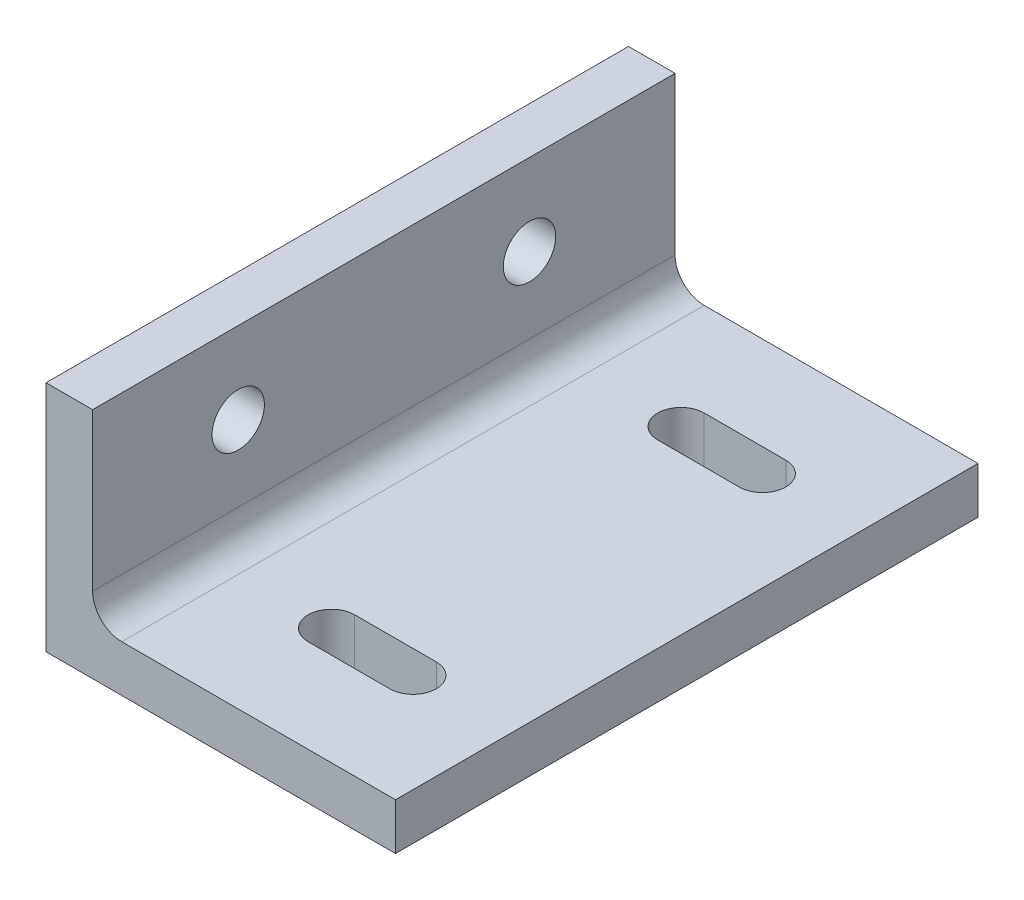
ISO-10303-21;
HEADER;
FILE_DESCRIPTION(('STEP AP214'),'2;1');
FILE_NAME('part.step','',(''),(''),'','','');
FILE_SCHEMA(('AUTOMOTIVE_DESIGN { 1 0 10303 214 1 1 1 1 }'));
ENDSEC;
DATA;
#1=APPLICATION_CONTEXT('core data for automotive mechanical design processes');
#2=APPLICATION_PROTOCOL_DEFINITION('international standard','automotive_design',2000,#1);
#3=PRODUCT_CONTEXT('',#1,'mechanical');
#4=PRODUCT('Part','Part','',(#3));
#5=PRODUCT_RELATED_PRODUCT_CATEGORY('part','',(#4));
#6=PRODUCT_DEFINITION_FORMATION('','',#4);
#7=PRODUCT_DEFINITION_CONTEXT('part definition',#1,'design');
#8=PRODUCT_DEFINITION('design','',#6,#7);
#9=PRODUCT_DEFINITION_SHAPE('','',#8);
#10=(LENGTH_UNIT() NAMED_UNIT(*) SI_UNIT(.MILLI.,.METRE.));
#11=(NAMED_UNIT(*) PLANE_ANGLE_UNIT() SI_UNIT($,.RADIAN.));
#12=(NAMED_UNIT(*) SI_UNIT($,.STERADIAN.) SOLID_ANGLE_UNIT());
#13=UNCERTAINTY_MEASURE_WITH_UNIT(LENGTH_MEASURE(1.E-05),#10,'distance_accuracy_value','');
#14=(GEOMETRIC_REPRESENTATION_CONTEXT(3) GLOBAL_UNCERTAINTY_ASSIGNED_CONTEXT((#13)) GLOBAL_UNIT_ASSIGNED_CONTEXT((#10,
#11,#12)) REPRESENTATION_CONTEXT('',''));
#15=CARTESIAN_POINT('',(0.,0.,0.));
#16=DIRECTION('',(0.,0.,1.));
#17=DIRECTION('',(1.,0.,0.));
#18=AXIS2_PLACEMENT_3D('',#15,#16,#17);
#19=CARTESIAN_POINT('',(0.,40.,100.));
#20=DIRECTION('',(1.,0.,0.));
#21=DIRECTION('',(0.,0.,-1.));
#22=AXIS2_PLACEMENT_3D('',#19,#20,#21);
#23=PLANE('',#22);
#24=CARTESIAN_POINT('',(0.,26.,25.));
#25=DIRECTION('',(1.,0.,0.));
#26=DIRECTION('',(0.,0.,-1.));
#27=AXIS2_PLACEMENT_3D('',#24,#25,#26);
#28=CIRCLE('',#27,4.5);
#29=CARTESIAN_POINT('',(0.,26.,20.5));
#30=VERTEX_POINT('',#29);
#31=EDGE_CURVE('E327',#30,#30,#28,.T.);
#32=ORIENTED_EDGE('',*,*,#31,.T.);
#33=EDGE_LOOP('',(#32));
#34=FACE_BOUND('',#33,.T.);
#35=CARTESIAN_POINT('',(0.,26.,75.));
#36=DIRECTION('',(1.,0.,0.));
#37=DIRECTION('',(0.,0.,-1.));
#38=AXIS2_PLACEMENT_3D('',#35,#36,#37);
#39=CIRCLE('',#38,4.5);
#40=CARTESIAN_POINT('',(0.,26.,70.5));
#41=VERTEX_POINT('',#40);
#42=EDGE_CURVE('E194',#41,#41,#39,.T.);
#43=ORIENTED_EDGE('',*,*,#42,.T.);
#44=EDGE_LOOP('',(#43));
#45=FACE_BOUND('',#44,.T.);
#46=DIRECTION('',(0.,-1.,0.));
#47=VECTOR('',#46,1.);
#48=CARTESIAN_POINT('',(0.,40.,0.));
#49=LINE('',#48,#47);
#50=CARTESIAN_POINT('',(0.,40.,0.));
#51=VERTEX_POINT('',#50);
#52=CARTESIAN_POINT('',(0.,0.,0.));
#53=VERTEX_POINT('',#52);
#54=EDGE_CURVE('E212',#51,#53,#49,.T.);
#55=ORIENTED_EDGE('',*,*,#54,.T.);
#56=DIRECTION('',(0.,0.,-1.));
#57=VECTOR('',#56,1.);
#58=CARTESIAN_POINT('',(0.,0.,100.));
#59=LINE('',#58,#57);
#60=CARTESIAN_POINT('',(0.,0.,100.));
#61=VERTEX_POINT('',#60);
#62=EDGE_CURVE('E11',#61,#53,#59,.T.);
#63=ORIENTED_EDGE('',*,*,#62,.F.);
#64=DIRECTION('',(0.,-1.,0.));
#65=VECTOR('',#64,1.);
#66=CARTESIAN_POINT('',(0.,40.,100.));
#67=LINE('',#66,#65);
#68=CARTESIAN_POINT('',(0.,40.,100.));
#69=VERTEX_POINT('',#68);
#70=EDGE_CURVE('E259',#69,#61,#67,.T.);
#71=ORIENTED_EDGE('',*,*,#70,.F.);
#72=DIRECTION('',(0.,0.,-1.));
#73=VECTOR('',#72,1.);
#74=CARTESIAN_POINT('',(0.,40.,100.));
#75=LINE('',#74,#73);
#76=EDGE_CURVE('E282',#69,#51,#75,.T.);
#77=ORIENTED_EDGE('',*,*,#76,.T.);
#78=EDGE_LOOP('',(#55,#63,#71,#77));
#79=FACE_BOUND('',#78,.T.);
#80=ADVANCED_FACE('F51',(#34,#45,#79),#23,.F.);
#81=CARTESIAN_POINT('',(0.,0.,100.));
#82=DIRECTION('',(0.,1.,0.));
#83=DIRECTION('',(0.,0.,1.));
#84=AXIS2_PLACEMENT_3D('',#81,#82,#83);
#85=PLANE('',#84);
#86=DIRECTION('',(-1.,0.,0.));
#87=VECTOR('',#86,1.);
#88=CARTESIAN_POINT('',(29.,0.,16.));
#89=LINE('',#88,#87);
#90=CARTESIAN_POINT('',(43.,0.,16.));
#91=VERTEX_POINT('',#90);
#92=CARTESIAN_POINT('',(29.,0.,16.));
#93=VERTEX_POINT('',#92);
#94=EDGE_CURVE('E173',#91,#93,#89,.T.);
#95=ORIENTED_EDGE('',*,*,#94,.T.);
#96=CARTESIAN_POINT('',(29.,0.,20.));
#97=DIRECTION('',(0.,1.,0.));
#98=DIRECTION('',(0.,0.,-1.));
#99=AXIS2_PLACEMENT_3D('',#96,#97,#98);
#100=CIRCLE('',#99,4.);
#101=CARTESIAN_POINT('',(29.,0.,24.));
#102=VERTEX_POINT('',#101);
#103=EDGE_CURVE('E164',#93,#102,#100,.T.);
#104=ORIENTED_EDGE('',*,*,#103,.T.);
#105=DIRECTION('',(1.,0.,0.));
#106=VECTOR('',#105,1.);
#107=CARTESIAN_POINT('',(43.,0.,24.));
#108=LINE('',#107,#106);
#109=CARTESIAN_POINT('',(43.,0.,24.));
#110=VERTEX_POINT('',#109);
#111=EDGE_CURVE('E176',#102,#110,#108,.T.);
#112=ORIENTED_EDGE('',*,*,#111,.T.);
#113=CARTESIAN_POINT('',(43.,0.,20.));
#114=DIRECTION('',(0.,1.,0.));
#115=DIRECTION('',(0.,0.,-1.));
#116=AXIS2_PLACEMENT_3D('',#113,#114,#115);
#117=CIRCLE('',#116,4.);
#118=EDGE_CURVE('E68',#110,#91,#117,.T.);
#119=ORIENTED_EDGE('',*,*,#118,.T.);
#120=EDGE_LOOP('',(#95,#104,#112,#119));
#121=FACE_BOUND('',#120,.T.);
#122=DIRECTION('',(-1.,0.,0.));
#123=VECTOR('',#122,1.);
#124=CARTESIAN_POINT('',(29.,0.,76.));
#125=LINE('',#124,#123);
#126=CARTESIAN_POINT('',(43.,0.,76.));
#127=VERTEX_POINT('',#126);
#128=CARTESIAN_POINT('',(29.,0.,76.));
#129=VERTEX_POINT('',#128);
#130=EDGE_CURVE('E222',#127,#129,#125,.T.);
#131=ORIENTED_EDGE('',*,*,#130,.T.);
#132=CARTESIAN_POINT('',(29.,0.,80.));
#133=DIRECTION('',(0.,1.,0.));
#134=DIRECTION('',(0.,0.,-1.));
#135=AXIS2_PLACEMENT_3D('',#132,#133,#134);
#136=CIRCLE('',#135,4.);
#137=CARTESIAN_POINT('',(29.,0.,84.));
#138=VERTEX_POINT('',#137);
#139=EDGE_CURVE('E237',#129,#138,#136,.T.);
#140=ORIENTED_EDGE('',*,*,#139,.T.);
#141=DIRECTION('',(1.,0.,0.));
#142=VECTOR('',#141,1.);
#143=CARTESIAN_POINT('',(43.,0.,84.));
#144=LINE('',#143,#142);
#145=CARTESIAN_POINT('',(43.,0.,84.));
#146=VERTEX_POINT('',#145);
#147=EDGE_CURVE('E252',#138,#146,#144,.T.);
#148=ORIENTED_EDGE('',*,*,#147,.T.);
#149=CARTESIAN_POINT('',(43.,0.,80.));
#150=DIRECTION('',(0.,1.,0.));
#151=DIRECTION('',(0.,0.,-1.));
#152=AXIS2_PLACEMENT_3D('',#149,#150,#151);
#153=CIRCLE('',#152,4.);
#154=EDGE_CURVE('E76',#146,#127,#153,.T.);
#155=ORIENTED_EDGE('',*,*,#154,.T.);
#156=EDGE_LOOP('',(#131,#140,#148,#155));
#157=FACE_BOUND('',#156,.T.);
#158=DIRECTION('',(1.,0.,0.));
#159=VECTOR('',#158,1.);
#160=CARTESIAN_POINT('',(0.,0.,0.));
#161=LINE('',#160,#159);
#162=CARTESIAN_POINT('',(60.,0.,0.));
#163=VERTEX_POINT('',#162);
#164=EDGE_CURVE('E286',#53,#163,#161,.T.);
#165=ORIENTED_EDGE('',*,*,#164,.T.);
#166=DIRECTION('',(0.,0.,-1.));
#167=VECTOR('',#166,1.);
#168=CARTESIAN_POINT('',(60.,0.,100.));
#169=LINE('',#168,#167);
#170=CARTESIAN_POINT('',(60.,0.,100.));
#171=VERTEX_POINT('',#170);
#172=EDGE_CURVE('E60',#171,#163,#169,.T.);
#173=ORIENTED_EDGE('',*,*,#172,.F.);
#174=DIRECTION('',(1.,0.,0.));
#175=VECTOR('',#174,1.);
#176=CARTESIAN_POINT('',(0.,0.,100.));
#177=LINE('',#176,#175);
#178=EDGE_CURVE('E263',#61,#171,#177,.T.);
#179=ORIENTED_EDGE('',*,*,#178,.F.);
#180=ORIENTED_EDGE('',*,*,#62,.T.);
#181=EDGE_LOOP('',(#165,#173,#179,#180));
#182=FACE_BOUND('',#181,.T.);
#183=ADVANCED_FACE('F181',(#121,#157,#182),#85,.F.);
#184=CARTESIAN_POINT('',(60.,0.,100.));
#185=DIRECTION('',(-1.,0.,0.));
#186=DIRECTION('',(0.,0.,1.));
#187=AXIS2_PLACEMENT_3D('',#184,#185,#186);
#188=PLANE('',#187);
#189=DIRECTION('',(0.,1.,0.));
#190=VECTOR('',#189,1.);
#191=CARTESIAN_POINT('',(60.,0.,0.));
#192=LINE('',#191,#190);
#193=CARTESIAN_POINT('',(60.,8.,0.));
#194=VERTEX_POINT('',#193);
#195=EDGE_CURVE('E289',#163,#194,#192,.T.);
#196=ORIENTED_EDGE('',*,*,#195,.T.);
#197=DIRECTION('',(0.,0.,-1.));
#198=VECTOR('',#197,1.);
#199=CARTESIAN_POINT('',(60.,8.,100.));
#200=LINE('',#199,#198);
#201=CARTESIAN_POINT('',(60.,8.,100.));
#202=VERTEX_POINT('',#201);
#203=EDGE_CURVE('E318',#202,#194,#200,.T.);
#204=ORIENTED_EDGE('',*,*,#203,.F.);
#205=DIRECTION('',(0.,1.,0.));
#206=VECTOR('',#205,1.);
#207=CARTESIAN_POINT('',(60.,0.,100.));
#208=LINE('',#207,#206);
#209=EDGE_CURVE('E267',#171,#202,#208,.T.);
#210=ORIENTED_EDGE('',*,*,#209,.F.);
#211=ORIENTED_EDGE('',*,*,#172,.T.);
#212=EDGE_LOOP('',(#196,#204,#210,#211));
#213=FACE_BOUND('',#212,.T.);
#214=ADVANCED_FACE('F357',(#213),#188,.F.);
#215=CARTESIAN_POINT('',(60.,8.,100.));
#216=DIRECTION('',(0.,-1.,0.));
#217=DIRECTION('',(0.,0.,-1.));
#218=AXIS2_PLACEMENT_3D('',#215,#216,#217);
#219=PLANE('',#218);
#220=DIRECTION('',(1.,0.,0.));
#221=VECTOR('',#220,1.);
#222=CARTESIAN_POINT('',(43.,8.,24.));
#223=LINE('',#222,#221);
#224=CARTESIAN_POINT('',(29.,8.,24.));
#225=VERTEX_POINT('',#224);
#226=CARTESIAN_POINT('',(43.,8.,24.));
#227=VERTEX_POINT('',#226);
#228=EDGE_CURVE('E202',#225,#227,#223,.T.);
#229=ORIENTED_EDGE('',*,*,#228,.F.);
#230=CARTESIAN_POINT('',(29.,8.,20.));
#231=DIRECTION('',(0.,1.,0.));
#232=DIRECTION('',(0.,0.,-1.));
#233=AXIS2_PLACEMENT_3D('',#230,#231,#232);
#234=CIRCLE('',#233,4.);
#235=CARTESIAN_POINT('',(29.,8.,16.));
#236=VERTEX_POINT('',#235);
#237=EDGE_CURVE('E167',#236,#225,#234,.T.);
#238=ORIENTED_EDGE('',*,*,#237,.F.);
#239=DIRECTION('',(-1.,0.,0.));
#240=VECTOR('',#239,1.);
#241=CARTESIAN_POINT('',(29.,8.,16.));
#242=LINE('',#241,#240);
#243=CARTESIAN_POINT('',(43.,8.,16.));
#244=VERTEX_POINT('',#243);
#245=EDGE_CURVE('E185',#244,#236,#242,.T.);
#246=ORIENTED_EDGE('',*,*,#245,.F.);
#247=CARTESIAN_POINT('',(43.,8.,20.));
#248=DIRECTION('',(0.,1.,0.));
#249=DIRECTION('',(0.,0.,-1.));
#250=AXIS2_PLACEMENT_3D('',#247,#248,#249);
#251=CIRCLE('',#250,4.);
#252=EDGE_CURVE('E191',#227,#244,#251,.T.);
#253=ORIENTED_EDGE('',*,*,#252,.F.);
#254=EDGE_LOOP('',(#229,#238,#246,#253));
#255=FACE_BOUND('',#254,.T.);
#256=DIRECTION('',(1.,0.,0.));
#257=VECTOR('',#256,1.);
#258=CARTESIAN_POINT('',(43.,8.,84.));
#259=LINE('',#258,#257);
#260=CARTESIAN_POINT('',(29.,8.,84.));
#261=VERTEX_POINT('',#260);
#262=CARTESIAN_POINT('',(43.,8.,84.));
#263=VERTEX_POINT('',#262);
#264=EDGE_CURVE('E241',#261,#263,#259,.T.);
#265=ORIENTED_EDGE('',*,*,#264,.F.);
#266=CARTESIAN_POINT('',(29.,8.,80.));
#267=DIRECTION('',(0.,1.,0.));
#268=DIRECTION('',(0.,0.,-1.));
#269=AXIS2_PLACEMENT_3D('',#266,#267,#268);
#270=CIRCLE('',#269,4.);
#271=CARTESIAN_POINT('',(29.,8.,76.));
#272=VERTEX_POINT('',#271);
#273=EDGE_CURVE('E203',#272,#261,#270,.T.);
#274=ORIENTED_EDGE('',*,*,#273,.F.);
#275=DIRECTION('',(-1.,0.,0.));
#276=VECTOR('',#275,1.);
#277=CARTESIAN_POINT('',(29.,8.,76.));
#278=LINE('',#277,#276);
#279=CARTESIAN_POINT('',(43.,8.,76.));
#280=VERTEX_POINT('',#279);
#281=EDGE_CURVE('E232',#280,#272,#278,.T.);
#282=ORIENTED_EDGE('',*,*,#281,.F.);
#283=CARTESIAN_POINT('',(43.,8.,80.));
#284=DIRECTION('',(0.,1.,0.));
#285=DIRECTION('',(0.,0.,-1.));
#286=AXIS2_PLACEMENT_3D('',#283,#284,#285);
#287=CIRCLE('',#286,4.);
#288=EDGE_CURVE('E236',#263,#280,#287,.T.);
#289=ORIENTED_EDGE('',*,*,#288,.F.);
#290=EDGE_LOOP('',(#265,#274,#282,#289));
#291=FACE_BOUND('',#290,.T.);
#292=DIRECTION('',(-1.,0.,0.));
#293=VECTOR('',#292,1.);
#294=CARTESIAN_POINT('',(60.,8.,0.));
#295=LINE('',#294,#293);
#296=CARTESIAN_POINT('',(13.,8.,0.));
#297=VERTEX_POINT('',#296);
#298=EDGE_CURVE('E292',#194,#297,#295,.T.);
#299=ORIENTED_EDGE('',*,*,#298,.T.);
#300=DIRECTION('',(0.,0.,-1.));
#301=VECTOR('',#300,1.);
#302=CARTESIAN_POINT('',(13.,8.,100.));
#303=LINE('',#302,#301);
#304=CARTESIAN_POINT('',(13.,8.,100.));
#305=VERTEX_POINT('',#304);
#306=EDGE_CURVE('E314',#305,#297,#303,.T.);
#307=ORIENTED_EDGE('',*,*,#306,.F.);
#308=DIRECTION('',(-1.,0.,0.));
#309=VECTOR('',#308,1.);
#310=CARTESIAN_POINT('',(60.,8.,100.));
#311=LINE('',#310,#309);
#312=EDGE_CURVE('E270',#202,#305,#311,.T.);
#313=ORIENTED_EDGE('',*,*,#312,.F.);
#314=ORIENTED_EDGE('',*,*,#203,.T.);
#315=EDGE_LOOP('',(#299,#307,#313,#314));
#316=FACE_BOUND('',#315,.T.);
#317=ADVANCED_FACE('F360',(#255,#291,#316),#219,.F.);
#318=CARTESIAN_POINT('',(13.0001157653308,13.0001157653308,100.));
#319=DIRECTION('',(0.,0.,-1.));
#320=DIRECTION('',(-1.,0.,0.));
#321=AXIS2_PLACEMENT_3D('',#318,#319,#320);
#322=CYLINDRICAL_SURFACE('',#321,5.00011576667089);
#323=CARTESIAN_POINT('',(13.0001157653308,13.0001157653308,0.));
#324=DIRECTION('',(0.,0.,-1.));
#325=DIRECTION('',(-1.,0.,0.));
#326=AXIS2_PLACEMENT_3D('',#323,#324,#325);
#327=CIRCLE('',#326,5.00011576667089);
#328=CARTESIAN_POINT('',(8.,13.,0.));
#329=VERTEX_POINT('',#328);
#330=EDGE_CURVE('E295',#297,#329,#327,.T.);
#331=ORIENTED_EDGE('',*,*,#330,.T.);
#332=DIRECTION('',(0.,0.,-1.));
#333=VECTOR('',#332,1.);
#334=CARTESIAN_POINT('',(8.,13.,100.));
#335=LINE('',#334,#333);
#336=CARTESIAN_POINT('',(8.,13.,100.));
#337=VERTEX_POINT('',#336);
#338=EDGE_CURVE('E310',#337,#329,#335,.T.);
#339=ORIENTED_EDGE('',*,*,#338,.F.);
#340=CARTESIAN_POINT('',(13.0001157653308,13.0001157653308,100.));
#341=DIRECTION('',(0.,0.,-1.));
#342=DIRECTION('',(-1.,0.,0.));
#343=AXIS2_PLACEMENT_3D('',#340,#341,#342);
#344=CIRCLE('',#343,5.00011576667089);
#345=EDGE_CURVE('E273',#305,#337,#344,.T.);
#346=ORIENTED_EDGE('',*,*,#345,.F.);
#347=ORIENTED_EDGE('',*,*,#306,.T.);
#348=EDGE_LOOP('',(#331,#339,#346,#347));
#349=FACE_BOUND('',#348,.T.);
#350=ADVANCED_FACE('F366',(#349),#322,.F.);
#351=CARTESIAN_POINT('',(8.,13.,100.));
#352=DIRECTION('',(-1.,0.,0.));
#353=DIRECTION('',(0.,0.,1.));
#354=AXIS2_PLACEMENT_3D('',#351,#352,#353);
#355=PLANE('',#354);
#356=CARTESIAN_POINT('',(8.,26.,25.));
#357=DIRECTION('',(-1.,0.,0.));
#358=DIRECTION('',(0.,0.,1.));
#359=AXIS2_PLACEMENT_3D('',#356,#357,#358);
#360=CIRCLE('',#359,4.5);
#361=CARTESIAN_POINT('',(8.,26.,29.5));
#362=VERTEX_POINT('',#361);
#363=EDGE_CURVE('E54',#362,#362,#360,.F.);
#364=ORIENTED_EDGE('',*,*,#363,.F.);
#365=EDGE_LOOP('',(#364));
#366=FACE_BOUND('',#365,.T.);
#367=CARTESIAN_POINT('',(8.,26.,75.));
#368=DIRECTION('',(-1.,0.,0.));
#369=DIRECTION('',(0.,0.,1.));
#370=AXIS2_PLACEMENT_3D('',#367,#368,#369);
#371=CIRCLE('',#370,4.5);
#372=CARTESIAN_POINT('',(8.,26.,79.5));
#373=VERTEX_POINT('',#372);
#374=EDGE_CURVE('E324',#373,#373,#371,.F.);
#375=ORIENTED_EDGE('',*,*,#374,.F.);
#376=EDGE_LOOP('',(#375));
#377=FACE_BOUND('',#376,.T.);
#378=DIRECTION('',(0.,1.,0.));
#379=VECTOR('',#378,1.);
#380=CARTESIAN_POINT('',(8.,13.,0.));
#381=LINE('',#380,#379);
#382=CARTESIAN_POINT('',(8.,40.,0.));
#383=VERTEX_POINT('',#382);
#384=EDGE_CURVE('E298',#329,#383,#381,.T.);
#385=ORIENTED_EDGE('',*,*,#384,.T.);
#386=DIRECTION('',(0.,0.,-1.));
#387=VECTOR('',#386,1.);
#388=CARTESIAN_POINT('',(8.,40.,100.));
#389=LINE('',#388,#387);
#390=CARTESIAN_POINT('',(8.,40.,100.));
#391=VERTEX_POINT('',#390);
#392=EDGE_CURVE('E306',#391,#383,#389,.T.);
#393=ORIENTED_EDGE('',*,*,#392,.F.);
#394=DIRECTION('',(0.,1.,0.));
#395=VECTOR('',#394,1.);
#396=CARTESIAN_POINT('',(8.,13.,100.));
#397=LINE('',#396,#395);
#398=EDGE_CURVE('E276',#337,#391,#397,.T.);
#399=ORIENTED_EDGE('',*,*,#398,.F.);
#400=ORIENTED_EDGE('',*,*,#338,.T.);
#401=EDGE_LOOP('',(#385,#393,#399,#400));
#402=FACE_BOUND('',#401,.T.);
#403=ADVANCED_FACE('F372',(#366,#377,#402),#355,.F.);
#404=CARTESIAN_POINT('',(8.,40.,100.));
#405=DIRECTION('',(0.,-1.,0.));
#406=DIRECTION('',(0.,0.,-1.));
#407=AXIS2_PLACEMENT_3D('',#404,#405,#406);
#408=PLANE('',#407);
#409=DIRECTION('',(-1.,0.,0.));
#410=VECTOR('',#409,1.);
#411=CARTESIAN_POINT('',(8.,40.,0.));
#412=LINE('',#411,#410);
#413=EDGE_CURVE('E264',#383,#51,#412,.T.);
#414=ORIENTED_EDGE('',*,*,#413,.T.);
#415=ORIENTED_EDGE('',*,*,#76,.F.);
#416=DIRECTION('',(-1.,0.,0.));
#417=VECTOR('',#416,1.);
#418=CARTESIAN_POINT('',(8.,40.,100.));
#419=LINE('',#418,#417);
#420=EDGE_CURVE('E279',#391,#69,#419,.T.);
#421=ORIENTED_EDGE('',*,*,#420,.F.);
#422=ORIENTED_EDGE('',*,*,#392,.T.);
#423=EDGE_LOOP('',(#414,#415,#421,#422));
#424=FACE_BOUND('',#423,.T.);
#425=ADVANCED_FACE('F377',(#424),#408,.F.);
#426=CARTESIAN_POINT('',(13.0001157653308,13.0001157653308,100.));
#427=DIRECTION('',(0.,0.,-1.));
#428=DIRECTION('',(-1.,0.,0.));
#429=AXIS2_PLACEMENT_3D('',#426,#427,#428);
#430=PLANE('',#429);
#431=ORIENTED_EDGE('',*,*,#70,.T.);
#432=ORIENTED_EDGE('',*,*,#178,.T.);
#433=ORIENTED_EDGE('',*,*,#209,.T.);
#434=ORIENTED_EDGE('',*,*,#312,.T.);
#435=ORIENTED_EDGE('',*,*,#345,.T.);
#436=ORIENTED_EDGE('',*,*,#398,.T.);
#437=ORIENTED_EDGE('',*,*,#420,.T.);
#438=EDGE_LOOP('',(#431,#432,#433,#434,#435,#436,#437));
#439=FACE_BOUND('',#438,.T.);
#440=ADVANCED_FACE('F382',(#439),#430,.F.);
#441=CARTESIAN_POINT('',(13.0001157653308,13.0001157653308,0.));
#442=DIRECTION('',(0.,0.,-1.));
#443=DIRECTION('',(-1.,0.,0.));
#444=AXIS2_PLACEMENT_3D('',#441,#442,#443);
#445=PLANE('',#444);
#446=ORIENTED_EDGE('',*,*,#54,.F.);
#447=ORIENTED_EDGE('',*,*,#413,.F.);
#448=ORIENTED_EDGE('',*,*,#384,.F.);
#449=ORIENTED_EDGE('',*,*,#330,.F.);
#450=ORIENTED_EDGE('',*,*,#298,.F.);
#451=ORIENTED_EDGE('',*,*,#195,.F.);
#452=ORIENTED_EDGE('',*,*,#164,.F.);
#453=EDGE_LOOP('',(#446,#447,#448,#449,#450,#451,#452));
#454=FACE_BOUND('',#453,.T.);
#455=ADVANCED_FACE('F385',(#454),#445,.T.);
#456=CARTESIAN_POINT('',(29.,0.,80.));
#457=DIRECTION('',(0.,1.,0.));
#458=DIRECTION('',(0.,0.,1.));
#459=AXIS2_PLACEMENT_3D('',#456,#457,#458);
#460=CYLINDRICAL_SURFACE('',#459,4.);
#461=ORIENTED_EDGE('',*,*,#273,.T.);
#462=DIRECTION('',(0.,1.,0.));
#463=VECTOR('',#462,1.);
#464=CARTESIAN_POINT('',(29.,0.,84.));
#465=LINE('',#464,#463);
#466=EDGE_CURVE('E218',#138,#261,#465,.T.);
#467=ORIENTED_EDGE('',*,*,#466,.F.);
#468=ORIENTED_EDGE('',*,*,#139,.F.);
#469=DIRECTION('',(0.,1.,0.));
#470=VECTOR('',#469,1.);
#471=CARTESIAN_POINT('',(29.,0.,76.));
#472=LINE('',#471,#470);
#473=EDGE_CURVE('E229',#129,#272,#472,.T.);
#474=ORIENTED_EDGE('',*,*,#473,.T.);
#475=EDGE_LOOP('',(#461,#467,#468,#474));
#476=FACE_BOUND('',#475,.T.);
#477=ADVANCED_FACE('F389',(#476),#460,.F.);
#478=CARTESIAN_POINT('',(29.,0.,76.));
#479=DIRECTION('',(0.,0.,-1.));
#480=DIRECTION('',(-1.,0.,0.));
#481=AXIS2_PLACEMENT_3D('',#478,#479,#480);
#482=PLANE('',#481);
#483=ORIENTED_EDGE('',*,*,#281,.T.);
#484=ORIENTED_EDGE('',*,*,#473,.F.);
#485=ORIENTED_EDGE('',*,*,#130,.F.);
#486=DIRECTION('',(0.,1.,0.));
#487=VECTOR('',#486,1.);
#488=CARTESIAN_POINT('',(43.,0.,76.));
#489=LINE('',#488,#487);
#490=EDGE_CURVE('E226',#127,#280,#489,.T.);
#491=ORIENTED_EDGE('',*,*,#490,.T.);
#492=EDGE_LOOP('',(#483,#484,#485,#491));
#493=FACE_BOUND('',#492,.T.);
#494=ADVANCED_FACE('F395',(#493),#482,.F.);
#495=CARTESIAN_POINT('',(43.,0.,80.));
#496=DIRECTION('',(0.,1.,0.));
#497=DIRECTION('',(0.,0.,1.));
#498=AXIS2_PLACEMENT_3D('',#495,#496,#497);
#499=CYLINDRICAL_SURFACE('',#498,4.);
#500=ORIENTED_EDGE('',*,*,#288,.T.);
#501=ORIENTED_EDGE('',*,*,#490,.F.);
#502=ORIENTED_EDGE('',*,*,#154,.F.);
#503=DIRECTION('',(0.,1.,0.));
#504=VECTOR('',#503,1.);
#505=CARTESIAN_POINT('',(43.,0.,84.));
#506=LINE('',#505,#504);
#507=EDGE_CURVE('E223',#146,#263,#506,.T.);
#508=ORIENTED_EDGE('',*,*,#507,.T.);
#509=EDGE_LOOP('',(#500,#501,#502,#508));
#510=FACE_BOUND('',#509,.T.);
#511=ADVANCED_FACE('F399',(#510),#499,.F.);
#512=CARTESIAN_POINT('',(43.,0.,84.));
#513=DIRECTION('',(0.,0.,1.));
#514=DIRECTION('',(1.,0.,0.));
#515=AXIS2_PLACEMENT_3D('',#512,#513,#514);
#516=PLANE('',#515);
#517=ORIENTED_EDGE('',*,*,#264,.T.);
#518=ORIENTED_EDGE('',*,*,#507,.F.);
#519=ORIENTED_EDGE('',*,*,#147,.F.);
#520=ORIENTED_EDGE('',*,*,#466,.T.);
#521=EDGE_LOOP('',(#517,#518,#519,#520));
#522=FACE_BOUND('',#521,.T.);
#523=ADVANCED_FACE('F404',(#522),#516,.F.);
#524=CARTESIAN_POINT('',(29.,0.,20.));
#525=DIRECTION('',(0.,1.,0.));
#526=DIRECTION('',(0.,0.,1.));
#527=AXIS2_PLACEMENT_3D('',#524,#525,#526);
#528=CYLINDRICAL_SURFACE('',#527,4.);
#529=ORIENTED_EDGE('',*,*,#237,.T.);
#530=DIRECTION('',(0.,1.,0.));
#531=VECTOR('',#530,1.);
#532=CARTESIAN_POINT('',(29.,0.,24.));
#533=LINE('',#532,#531);
#534=EDGE_CURVE('E160',#102,#225,#533,.T.);
#535=ORIENTED_EDGE('',*,*,#534,.F.);
#536=ORIENTED_EDGE('',*,*,#103,.F.);
#537=DIRECTION('',(0.,1.,0.));
#538=VECTOR('',#537,1.);
#539=CARTESIAN_POINT('',(29.,0.,16.));
#540=LINE('',#539,#538);
#541=EDGE_CURVE('E209',#93,#236,#540,.T.);
#542=ORIENTED_EDGE('',*,*,#541,.T.);
#543=EDGE_LOOP('',(#529,#535,#536,#542));
#544=FACE_BOUND('',#543,.T.);
#545=ADVANCED_FACE('F162',(#544),#528,.F.);
#546=CARTESIAN_POINT('',(29.,0.,16.));
#547=DIRECTION('',(0.,0.,-1.));
#548=DIRECTION('',(-1.,0.,0.));
#549=AXIS2_PLACEMENT_3D('',#546,#547,#548);
#550=PLANE('',#549);
#551=ORIENTED_EDGE('',*,*,#245,.T.);
#552=ORIENTED_EDGE('',*,*,#541,.F.);
#553=ORIENTED_EDGE('',*,*,#94,.F.);
#554=DIRECTION('',(0.,1.,0.));
#555=VECTOR('',#554,1.);
#556=CARTESIAN_POINT('',(43.,0.,16.));
#557=LINE('',#556,#555);
#558=EDGE_CURVE('E213',#91,#244,#557,.T.);
#559=ORIENTED_EDGE('',*,*,#558,.T.);
#560=EDGE_LOOP('',(#551,#552,#553,#559));
#561=FACE_BOUND('',#560,.T.);
#562=ADVANCED_FACE('F414',(#561),#550,.F.);
#563=CARTESIAN_POINT('',(43.,0.,20.));
#564=DIRECTION('',(0.,1.,0.));
#565=DIRECTION('',(0.,0.,1.));
#566=AXIS2_PLACEMENT_3D('',#563,#564,#565);
#567=CYLINDRICAL_SURFACE('',#566,4.);
#568=ORIENTED_EDGE('',*,*,#252,.T.);
#569=ORIENTED_EDGE('',*,*,#558,.F.);
#570=ORIENTED_EDGE('',*,*,#118,.F.);
#571=DIRECTION('',(0.,1.,0.));
#572=VECTOR('',#571,1.);
#573=CARTESIAN_POINT('',(43.,0.,24.));
#574=LINE('',#573,#572);
#575=EDGE_CURVE('E172',#110,#227,#574,.T.);
#576=ORIENTED_EDGE('',*,*,#575,.T.);
#577=EDGE_LOOP('',(#568,#569,#570,#576));
#578=FACE_BOUND('',#577,.T.);
#579=ADVANCED_FACE('F350',(#578),#567,.F.);
#580=CARTESIAN_POINT('',(43.,0.,24.));
#581=DIRECTION('',(0.,0.,1.));
#582=DIRECTION('',(1.,0.,0.));
#583=AXIS2_PLACEMENT_3D('',#580,#581,#582);
#584=PLANE('',#583);
#585=ORIENTED_EDGE('',*,*,#228,.T.);
#586=ORIENTED_EDGE('',*,*,#575,.F.);
#587=ORIENTED_EDGE('',*,*,#111,.F.);
#588=ORIENTED_EDGE('',*,*,#534,.T.);
#589=EDGE_LOOP('',(#585,#586,#587,#588));
#590=FACE_BOUND('',#589,.T.);
#591=ADVANCED_FACE('F177',(#590),#584,.F.);
#592=CARTESIAN_POINT('',(60.,26.,75.));
#593=DIRECTION('',(-1.,0.,0.));
#594=DIRECTION('',(0.,0.,1.));
#595=AXIS2_PLACEMENT_3D('',#592,#593,#594);
#596=CYLINDRICAL_SURFACE('',#595,4.5);
#597=ORIENTED_EDGE('',*,*,#42,.F.);
#598=EDGE_LOOP('',(#597));
#599=FACE_BOUND('',#598,.T.);
#600=ORIENTED_EDGE('',*,*,#374,.T.);
#601=EDGE_LOOP('',(#600));
#602=FACE_BOUND('',#601,.T.);
#603=ADVANCED_FACE('F341',(#599,#602),#596,.F.);
#604=CARTESIAN_POINT('',(60.,26.,25.));
#605=DIRECTION('',(-1.,0.,0.));
#606=DIRECTION('',(0.,0.,1.));
#607=AXIS2_PLACEMENT_3D('',#604,#605,#606);
#608=CYLINDRICAL_SURFACE('',#607,4.5);
#609=ORIENTED_EDGE('',*,*,#31,.F.);
#610=EDGE_LOOP('',(#609));
#611=FACE_BOUND('',#610,.T.);
#612=ORIENTED_EDGE('',*,*,#363,.T.);
#613=EDGE_LOOP('',(#612));
#614=FACE_BOUND('',#613,.T.);
#615=ADVANCED_FACE('F343',(#611,#614),#608,.F.);
#616=CLOSED_SHELL('',(#80,#183,#214,#317,#350,#403,#425,#440,#455,#477,#494,#511,#523,#545,#562,
#579,#591,#603,#615));
#617=MANIFOLD_SOLID_BREP('B2',#616);
#618=ADVANCED_BREP_SHAPE_REPRESENTATION('',(#18,#617),#14);
#619=SHAPE_DEFINITION_REPRESENTATION(#9,#618);
ENDSEC;
END-ISO-10303-21;
